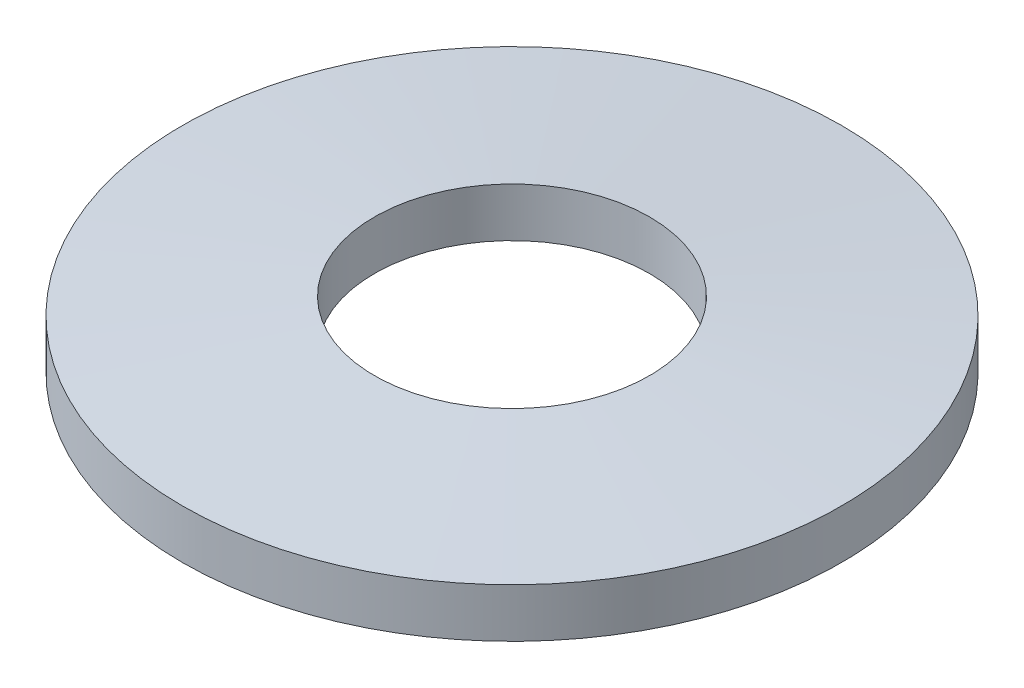
ISO-10303-21;
HEADER;
FILE_DESCRIPTION(('STEP AP214'),'2;1');
FILE_NAME('part.step','',(''),(''),'','','');
FILE_SCHEMA(('AUTOMOTIVE_DESIGN { 1 0 10303 214 1 1 1 1 }'));
ENDSEC;
DATA;
#1=APPLICATION_CONTEXT('core data for automotive mechanical design processes');
#2=APPLICATION_PROTOCOL_DEFINITION('international standard','automotive_design',2000,#1);
#3=PRODUCT_CONTEXT('',#1,'mechanical');
#4=PRODUCT('Part','Part','',(#3));
#5=PRODUCT_RELATED_PRODUCT_CATEGORY('part','',(#4));
#6=PRODUCT_DEFINITION_FORMATION('','',#4);
#7=PRODUCT_DEFINITION_CONTEXT('part definition',#1,'design');
#8=PRODUCT_DEFINITION('design','',#6,#7);
#9=PRODUCT_DEFINITION_SHAPE('','',#8);
#10=(LENGTH_UNIT() NAMED_UNIT(*) SI_UNIT(.MILLI.,.METRE.));
#11=(NAMED_UNIT(*) PLANE_ANGLE_UNIT() SI_UNIT($,.RADIAN.));
#12=(NAMED_UNIT(*) SI_UNIT($,.STERADIAN.) SOLID_ANGLE_UNIT());
#13=UNCERTAINTY_MEASURE_WITH_UNIT(LENGTH_MEASURE(1.E-05),#10,'distance_accuracy_value','');
#14=(GEOMETRIC_REPRESENTATION_CONTEXT(3) GLOBAL_UNCERTAINTY_ASSIGNED_CONTEXT((#13)) GLOBAL_UNIT_ASSIGNED_CONTEXT((#10,
#11,#12)) REPRESENTATION_CONTEXT('',''));
#15=CARTESIAN_POINT('',(0.,0.,0.));
#16=DIRECTION('',(0.,0.,1.));
#17=DIRECTION('',(1.,0.,0.));
#18=AXIS2_PLACEMENT_3D('',#15,#16,#17);
#19=CARTESIAN_POINT('',(0.,0.892395835576036,0.));
#20=DIRECTION('',(0.,-1.,0.));
#21=DIRECTION('',(0.,0.,-1.));
#22=AXIS2_PLACEMENT_3D('',#19,#20,#21);
#23=CONICAL_SURFACE('',#22,5.9944,1.48352986419518);
#24=CARTESIAN_POINT('',(0.,1.19794999294031,0.));
#25=DIRECTION('',(0.,-1.,0.));
#26=DIRECTION('',(0.,0.,-1.));
#27=AXIS2_PLACEMENT_3D('',#24,#25,#26);
#28=CIRCLE('',#27,2.5019);
#29=CARTESIAN_POINT('',(0.,1.19794999294031,-2.5019));
#30=VERTEX_POINT('',#29);
#31=EDGE_CURVE('E10',#30,#30,#28,.T.);
#32=ORIENTED_EDGE('',*,*,#31,.T.);
#33=EDGE_LOOP('',(#32));
#34=FACE_BOUND('',#33,.T.);
#35=CARTESIAN_POINT('',(0.,0.892395835576036,0.));
#36=DIRECTION('',(0.,-1.,0.));
#37=DIRECTION('',(0.,0.,-1.));
#38=AXIS2_PLACEMENT_3D('',#35,#36,#37);
#39=CIRCLE('',#38,5.9944);
#40=CARTESIAN_POINT('',(0.,0.892395835576036,-5.9944));
#41=VERTEX_POINT('',#40);
#42=EDGE_CURVE('E48',#41,#41,#39,.T.);
#43=ORIENTED_EDGE('',*,*,#42,.F.);
#44=EDGE_LOOP('',(#43));
#45=FACE_BOUND('',#44,.T.);
#46=ADVANCED_FACE('F34',(#34,#45),#23,.T.);
#47=CARTESIAN_POINT('',(0.,4.73405385694598,0.));
#48=DIRECTION('',(0.,-1.,0.));
#49=DIRECTION('',(0.,0.,-1.));
#50=AXIS2_PLACEMENT_3D('',#47,#48,#49);
#51=CYLINDRICAL_SURFACE('',#50,2.5019);
#52=CARTESIAN_POINT('',(0.,0.305554157364276,0.));
#53=DIRECTION('',(0.,-1.,0.));
#54=DIRECTION('',(0.,0.,-1.));
#55=AXIS2_PLACEMENT_3D('',#52,#53,#54);
#56=CIRCLE('',#55,2.5019);
#57=CARTESIAN_POINT('',(0.,0.305554157364276,-2.5019));
#58=VERTEX_POINT('',#57);
#59=EDGE_CURVE('E40',#58,#58,#56,.T.);
#60=ORIENTED_EDGE('',*,*,#59,.T.);
#61=EDGE_LOOP('',(#60));
#62=FACE_BOUND('',#61,.T.);
#63=ORIENTED_EDGE('',*,*,#31,.F.);
#64=EDGE_LOOP('',(#63));
#65=FACE_BOUND('',#64,.T.);
#66=ADVANCED_FACE('F58',(#62,#65),#51,.F.);
#67=CARTESIAN_POINT('',(0.,0.305554157364276,0.));
#68=DIRECTION('',(0.,-1.,0.));
#69=DIRECTION('',(0.,0.,-1.));
#70=AXIS2_PLACEMENT_3D('',#67,#68,#69);
#71=CONICAL_SURFACE('',#70,2.5019,1.48352986419518);
#72=CARTESIAN_POINT('',(0.,0.,0.));
#73=DIRECTION('',(0.,-1.,0.));
#74=DIRECTION('',(0.,0.,-1.));
#75=AXIS2_PLACEMENT_3D('',#72,#73,#74);
#76=CIRCLE('',#75,5.9944);
#77=CARTESIAN_POINT('',(0.,0.,-5.9944));
#78=VERTEX_POINT('',#77);
#79=EDGE_CURVE('E44',#78,#78,#76,.T.);
#80=ORIENTED_EDGE('',*,*,#79,.T.);
#81=EDGE_LOOP('',(#80));
#82=FACE_BOUND('',#81,.T.);
#83=ORIENTED_EDGE('',*,*,#59,.F.);
#84=EDGE_LOOP('',(#83));
#85=FACE_BOUND('',#84,.T.);
#86=ADVANCED_FACE('F62',(#82,#85),#71,.F.);
#87=CARTESIAN_POINT('',(0.,4.73405385694598,0.));
#88=DIRECTION('',(0.,-1.,0.));
#89=DIRECTION('',(0.,0.,-1.));
#90=AXIS2_PLACEMENT_3D('',#87,#88,#89);
#91=CYLINDRICAL_SURFACE('',#90,5.9944);
#92=ORIENTED_EDGE('',*,*,#42,.T.);
#93=EDGE_LOOP('',(#92));
#94=FACE_BOUND('',#93,.T.);
#95=ORIENTED_EDGE('',*,*,#79,.F.);
#96=EDGE_LOOP('',(#95));
#97=FACE_BOUND('',#96,.T.);
#98=ADVANCED_FACE('F54',(#94,#97),#91,.T.);
#99=CLOSED_SHELL('',(#46,#66,#86,#98));
#100=MANIFOLD_SOLID_BREP('B2',#99);
#101=ADVANCED_BREP_SHAPE_REPRESENTATION('',(#18,#100),#14);
#102=SHAPE_DEFINITION_REPRESENTATION(#9,#101);
ENDSEC;
END-ISO-10303-21;
